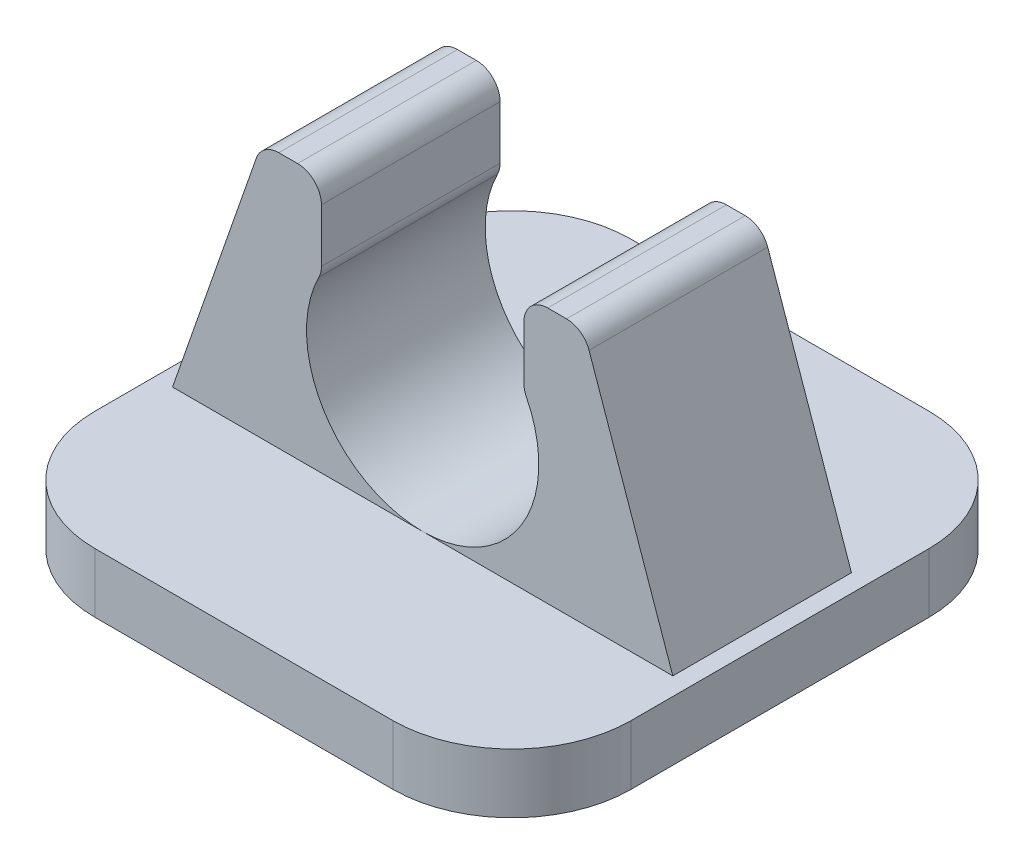
ISO-10303-21;
HEADER;
FILE_DESCRIPTION(('STEP AP214'),'2;1');
FILE_NAME('part.step','',(''),(''),'','','');
FILE_SCHEMA(('AUTOMOTIVE_DESIGN { 1 0 10303 214 1 1 1 1 }'));
ENDSEC;
DATA;
#1=APPLICATION_CONTEXT('core data for automotive mechanical design processes');
#2=APPLICATION_PROTOCOL_DEFINITION('international standard','automotive_design',2000,#1);
#3=PRODUCT_CONTEXT('',#1,'mechanical');
#4=PRODUCT('Part','Part','',(#3));
#5=PRODUCT_RELATED_PRODUCT_CATEGORY('part','',(#4));
#6=PRODUCT_DEFINITION_FORMATION('','',#4);
#7=PRODUCT_DEFINITION_CONTEXT('part definition',#1,'design');
#8=PRODUCT_DEFINITION('design','',#6,#7);
#9=PRODUCT_DEFINITION_SHAPE('','',#8);
#10=(LENGTH_UNIT() NAMED_UNIT(*) SI_UNIT(.MILLI.,.METRE.));
#11=(NAMED_UNIT(*) PLANE_ANGLE_UNIT() SI_UNIT($,.RADIAN.));
#12=(NAMED_UNIT(*) SI_UNIT($,.STERADIAN.) SOLID_ANGLE_UNIT());
#13=UNCERTAINTY_MEASURE_WITH_UNIT(LENGTH_MEASURE(1.E-05),#10,'distance_accuracy_value','');
#14=(GEOMETRIC_REPRESENTATION_CONTEXT(3) GLOBAL_UNCERTAINTY_ASSIGNED_CONTEXT((#13)) GLOBAL_UNIT_ASSIGNED_CONTEXT((#10,
#11,#12)) REPRESENTATION_CONTEXT('',''));
#15=CARTESIAN_POINT('',(0.,0.,0.));
#16=DIRECTION('',(0.,0.,1.));
#17=DIRECTION('',(1.,0.,0.));
#18=AXIS2_PLACEMENT_3D('',#15,#16,#17);
#19=CARTESIAN_POINT('',(0.,1.,0.));
#20=DIRECTION('',(0.,-1.,0.));
#21=DIRECTION('',(0.,0.,-1.));
#22=AXIS2_PLACEMENT_3D('',#19,#20,#21);
#23=PLANE('',#22);
#24=DIRECTION('',(1.,0.,0.));
#25=VECTOR('',#24,1.);
#26=CARTESIAN_POINT('',(-4.5,1.,4.5));
#27=LINE('',#26,#25);
#28=CARTESIAN_POINT('',(-2.5,1.,4.5));
#29=VERTEX_POINT('',#28);
#30=CARTESIAN_POINT('',(2.5,1.,4.5));
#31=VERTEX_POINT('',#30);
#32=EDGE_CURVE('E316',#29,#31,#27,.T.);
#33=ORIENTED_EDGE('',*,*,#32,.T.);
#34=CARTESIAN_POINT('',(2.5,1.,2.5));
#35=DIRECTION('',(0.,-1.,0.));
#36=DIRECTION('',(0.,0.,-1.));
#37=AXIS2_PLACEMENT_3D('',#34,#35,#36);
#38=CIRCLE('',#37,2.);
#39=CARTESIAN_POINT('',(4.5,1.,2.5));
#40=VERTEX_POINT('',#39);
#41=EDGE_CURVE('E402',#31,#40,#38,.F.);
#42=ORIENTED_EDGE('',*,*,#41,.T.);
#43=DIRECTION('',(0.,0.,-1.));
#44=VECTOR('',#43,1.);
#45=CARTESIAN_POINT('',(4.5,1.,4.5));
#46=LINE('',#45,#44);
#47=CARTESIAN_POINT('',(4.5,1.,-2.5));
#48=VERTEX_POINT('',#47);
#49=EDGE_CURVE('E308',#40,#48,#46,.T.);
#50=ORIENTED_EDGE('',*,*,#49,.T.);
#51=CARTESIAN_POINT('',(2.5,1.,-2.5));
#52=DIRECTION('',(0.,-1.,0.));
#53=DIRECTION('',(0.,0.,-1.));
#54=AXIS2_PLACEMENT_3D('',#51,#52,#53);
#55=CIRCLE('',#54,2.);
#56=CARTESIAN_POINT('',(2.5,1.,-4.5));
#57=VERTEX_POINT('',#56);
#58=EDGE_CURVE('E397',#48,#57,#55,.F.);
#59=ORIENTED_EDGE('',*,*,#58,.T.);
#60=DIRECTION('',(-1.,0.,0.));
#61=VECTOR('',#60,1.);
#62=CARTESIAN_POINT('',(-4.5,1.,-4.5));
#63=LINE('',#62,#61);
#64=CARTESIAN_POINT('',(-2.5,1.,-4.5));
#65=VERTEX_POINT('',#64);
#66=EDGE_CURVE('E311',#57,#65,#63,.T.);
#67=ORIENTED_EDGE('',*,*,#66,.T.);
#68=CARTESIAN_POINT('',(-2.5,1.,-2.5));
#69=DIRECTION('',(0.,-1.,0.));
#70=DIRECTION('',(0.,0.,-1.));
#71=AXIS2_PLACEMENT_3D('',#68,#69,#70);
#72=CIRCLE('',#71,2.);
#73=CARTESIAN_POINT('',(-4.5,1.,-2.5));
#74=VERTEX_POINT('',#73);
#75=EDGE_CURVE('E95',#65,#74,#72,.F.);
#76=ORIENTED_EDGE('',*,*,#75,.T.);
#77=DIRECTION('',(0.,0.,1.));
#78=VECTOR('',#77,1.);
#79=CARTESIAN_POINT('',(-4.5,1.,4.5));
#80=LINE('',#79,#78);
#81=CARTESIAN_POINT('',(-4.5,1.,2.5));
#82=VERTEX_POINT('',#81);
#83=EDGE_CURVE('E314',#74,#82,#80,.T.);
#84=ORIENTED_EDGE('',*,*,#83,.T.);
#85=CARTESIAN_POINT('',(-2.5,1.,2.5));
#86=DIRECTION('',(0.,-1.,0.));
#87=DIRECTION('',(0.,0.,-1.));
#88=AXIS2_PLACEMENT_3D('',#85,#86,#87);
#89=CIRCLE('',#88,2.);
#90=EDGE_CURVE('E400',#82,#29,#89,.F.);
#91=ORIENTED_EDGE('',*,*,#90,.T.);
#92=EDGE_LOOP('',(#33,#42,#50,#59,#67,#76,#84,#91));
#93=FACE_BOUND('',#92,.T.);
#94=DIRECTION('',(-1.,0.,0.));
#95=VECTOR('',#94,1.);
#96=CARTESIAN_POINT('',(0.,1.,-1.5));
#97=LINE('',#96,#95);
#98=CARTESIAN_POINT('',(4.2,1.,-1.5));
#99=VERTEX_POINT('',#98);
#100=CARTESIAN_POINT('',(0.,1.,-1.5));
#101=VERTEX_POINT('',#100);
#102=EDGE_CURVE('E241',#99,#101,#97,.T.);
#103=ORIENTED_EDGE('',*,*,#102,.F.);
#104=DIRECTION('',(0.,0.,1.));
#105=VECTOR('',#104,1.);
#106=CARTESIAN_POINT('',(4.2,1.,-1.5));
#107=LINE('',#106,#105);
#108=CARTESIAN_POINT('',(4.2,1.,1.5));
#109=VERTEX_POINT('',#108);
#110=EDGE_CURVE('E259',#99,#109,#107,.T.);
#111=ORIENTED_EDGE('',*,*,#110,.T.);
#112=DIRECTION('',(-1.,0.,0.));
#113=VECTOR('',#112,1.);
#114=CARTESIAN_POINT('',(0.,1.,1.5));
#115=LINE('',#114,#113);
#116=CARTESIAN_POINT('',(0.,1.,1.5));
#117=VERTEX_POINT('',#116);
#118=EDGE_CURVE('E256',#109,#117,#115,.T.);
#119=ORIENTED_EDGE('',*,*,#118,.T.);
#120=DIRECTION('',(-1.,0.,0.));
#121=VECTOR('',#120,1.);
#122=CARTESIAN_POINT('',(0.,1.,1.5));
#123=LINE('',#122,#121);
#124=CARTESIAN_POINT('',(-4.2,1.,1.5));
#125=VERTEX_POINT('',#124);
#126=EDGE_CURVE('E244',#117,#125,#123,.T.);
#127=ORIENTED_EDGE('',*,*,#126,.T.);
#128=DIRECTION('',(0.,0.,1.));
#129=VECTOR('',#128,1.);
#130=CARTESIAN_POINT('',(-4.2,1.,-1.5));
#131=LINE('',#130,#129);
#132=CARTESIAN_POINT('',(-4.2,1.,-1.5));
#133=VERTEX_POINT('',#132);
#134=EDGE_CURVE('E298',#133,#125,#131,.T.);
#135=ORIENTED_EDGE('',*,*,#134,.F.);
#136=DIRECTION('',(-1.,0.,0.));
#137=VECTOR('',#136,1.);
#138=CARTESIAN_POINT('',(0.,1.,-1.5));
#139=LINE('',#138,#137);
#140=EDGE_CURVE('E296',#101,#133,#139,.T.);
#141=ORIENTED_EDGE('',*,*,#140,.F.);
#142=EDGE_LOOP('',(#103,#111,#119,#127,#135,#141));
#143=FACE_BOUND('',#142,.T.);
#144=ADVANCED_FACE('F73',(#93,#143),#23,.F.);
#145=CARTESIAN_POINT('',(4.5,1.,4.5));
#146=DIRECTION('',(-1.,0.,0.));
#147=DIRECTION('',(0.,0.,1.));
#148=AXIS2_PLACEMENT_3D('',#145,#146,#147);
#149=PLANE('',#148);
#150=ORIENTED_EDGE('',*,*,#49,.F.);
#151=DIRECTION('',(0.,-1.,0.));
#152=VECTOR('',#151,1.);
#153=CARTESIAN_POINT('',(4.5,1.,2.5));
#154=LINE('',#153,#152);
#155=CARTESIAN_POINT('',(4.5,0.,2.5));
#156=VERTEX_POINT('',#155);
#157=EDGE_CURVE('E381',#40,#156,#154,.T.);
#158=ORIENTED_EDGE('',*,*,#157,.T.);
#159=DIRECTION('',(0.,0.,-1.));
#160=VECTOR('',#159,1.);
#161=CARTESIAN_POINT('',(4.5,0.,4.5));
#162=LINE('',#161,#160);
#163=CARTESIAN_POINT('',(4.5,0.,-2.5));
#164=VERTEX_POINT('',#163);
#165=EDGE_CURVE('E307',#156,#164,#162,.T.);
#166=ORIENTED_EDGE('',*,*,#165,.T.);
#167=DIRECTION('',(0.,-1.,0.));
#168=VECTOR('',#167,1.);
#169=CARTESIAN_POINT('',(4.5,1.,-2.5));
#170=LINE('',#169,#168);
#171=EDGE_CURVE('E379',#164,#48,#170,.F.);
#172=ORIENTED_EDGE('',*,*,#171,.T.);
#173=EDGE_LOOP('',(#150,#158,#166,#172));
#174=FACE_BOUND('',#173,.T.);
#175=ADVANCED_FACE('F439',(#174),#149,.F.);
#176=CARTESIAN_POINT('',(-4.5,1.,-4.5));
#177=DIRECTION('',(0.,0.,1.));
#178=DIRECTION('',(1.,0.,0.));
#179=AXIS2_PLACEMENT_3D('',#176,#177,#178);
#180=PLANE('',#179);
#181=DIRECTION('',(-1.,0.,0.));
#182=VECTOR('',#181,1.);
#183=CARTESIAN_POINT('',(-4.5,0.,-4.5));
#184=LINE('',#183,#182);
#185=CARTESIAN_POINT('',(2.5,0.,-4.5));
#186=VERTEX_POINT('',#185);
#187=CARTESIAN_POINT('',(-2.5,0.,-4.5));
#188=VERTEX_POINT('',#187);
#189=EDGE_CURVE('E322',#186,#188,#184,.T.);
#190=ORIENTED_EDGE('',*,*,#189,.T.);
#191=DIRECTION('',(0.,-1.,0.));
#192=VECTOR('',#191,1.);
#193=CARTESIAN_POINT('',(-2.5,1.,-4.5));
#194=LINE('',#193,#192);
#195=EDGE_CURVE('E12',#188,#65,#194,.F.);
#196=ORIENTED_EDGE('',*,*,#195,.T.);
#197=ORIENTED_EDGE('',*,*,#66,.F.);
#198=DIRECTION('',(0.,-1.,0.));
#199=VECTOR('',#198,1.);
#200=CARTESIAN_POINT('',(2.5,1.,-4.5));
#201=LINE('',#200,#199);
#202=EDGE_CURVE('E81',#57,#186,#201,.T.);
#203=ORIENTED_EDGE('',*,*,#202,.T.);
#204=EDGE_LOOP('',(#190,#196,#197,#203));
#205=FACE_BOUND('',#204,.T.);
#206=ADVANCED_FACE('F412',(#205),#180,.F.);
#207=CARTESIAN_POINT('',(-4.5,1.,4.5));
#208=DIRECTION('',(1.,0.,0.));
#209=DIRECTION('',(0.,0.,-1.));
#210=AXIS2_PLACEMENT_3D('',#207,#208,#209);
#211=PLANE('',#210);
#212=DIRECTION('',(0.,0.,1.));
#213=VECTOR('',#212,1.);
#214=CARTESIAN_POINT('',(-4.5,0.,4.5));
#215=LINE('',#214,#213);
#216=CARTESIAN_POINT('',(-4.5,0.,-2.5));
#217=VERTEX_POINT('',#216);
#218=CARTESIAN_POINT('',(-4.5,0.,2.5));
#219=VERTEX_POINT('',#218);
#220=EDGE_CURVE('E325',#217,#219,#215,.T.);
#221=ORIENTED_EDGE('',*,*,#220,.T.);
#222=DIRECTION('',(0.,-1.,0.));
#223=VECTOR('',#222,1.);
#224=CARTESIAN_POINT('',(-4.5,1.,2.5));
#225=LINE('',#224,#223);
#226=EDGE_CURVE('E88',#219,#82,#225,.F.);
#227=ORIENTED_EDGE('',*,*,#226,.T.);
#228=ORIENTED_EDGE('',*,*,#83,.F.);
#229=DIRECTION('',(0.,-1.,0.));
#230=VECTOR('',#229,1.);
#231=CARTESIAN_POINT('',(-4.5,1.,-2.5));
#232=LINE('',#231,#230);
#233=EDGE_CURVE('E404',#74,#217,#232,.T.);
#234=ORIENTED_EDGE('',*,*,#233,.T.);
#235=EDGE_LOOP('',(#221,#227,#228,#234));
#236=FACE_BOUND('',#235,.T.);
#237=ADVANCED_FACE('F423',(#236),#211,.F.);
#238=CARTESIAN_POINT('',(-4.5,1.,4.5));
#239=DIRECTION('',(0.,0.,-1.));
#240=DIRECTION('',(-1.,0.,0.));
#241=AXIS2_PLACEMENT_3D('',#238,#239,#240);
#242=PLANE('',#241);
#243=DIRECTION('',(1.,0.,0.));
#244=VECTOR('',#243,1.);
#245=CARTESIAN_POINT('',(-4.5,0.,4.5));
#246=LINE('',#245,#244);
#247=CARTESIAN_POINT('',(-2.5,0.,4.5));
#248=VERTEX_POINT('',#247);
#249=CARTESIAN_POINT('',(2.5,0.,4.5));
#250=VERTEX_POINT('',#249);
#251=EDGE_CURVE('E312',#248,#250,#246,.T.);
#252=ORIENTED_EDGE('',*,*,#251,.T.);
#253=DIRECTION('',(0.,-1.,0.));
#254=VECTOR('',#253,1.);
#255=CARTESIAN_POINT('',(2.5,1.,4.5));
#256=LINE('',#255,#254);
#257=EDGE_CURVE('E395',#250,#31,#256,.F.);
#258=ORIENTED_EDGE('',*,*,#257,.T.);
#259=ORIENTED_EDGE('',*,*,#32,.F.);
#260=DIRECTION('',(0.,-1.,0.));
#261=VECTOR('',#260,1.);
#262=CARTESIAN_POINT('',(-2.5,1.,4.5));
#263=LINE('',#262,#261);
#264=EDGE_CURVE('E392',#29,#248,#263,.T.);
#265=ORIENTED_EDGE('',*,*,#264,.T.);
#266=EDGE_LOOP('',(#252,#258,#259,#265));
#267=FACE_BOUND('',#266,.T.);
#268=ADVANCED_FACE('F431',(#267),#242,.F.);
#269=CARTESIAN_POINT('',(0.,0.,0.));
#270=DIRECTION('',(0.,-1.,0.));
#271=DIRECTION('',(0.,0.,-1.));
#272=AXIS2_PLACEMENT_3D('',#269,#270,#271);
#273=PLANE('',#272);
#274=ORIENTED_EDGE('',*,*,#165,.F.);
#275=CARTESIAN_POINT('',(2.5,0.,2.5));
#276=DIRECTION('',(0.,-1.,0.));
#277=DIRECTION('',(0.,0.,-1.));
#278=AXIS2_PLACEMENT_3D('',#275,#276,#277);
#279=CIRCLE('',#278,2.);
#280=EDGE_CURVE('E390',#156,#250,#279,.T.);
#281=ORIENTED_EDGE('',*,*,#280,.T.);
#282=ORIENTED_EDGE('',*,*,#251,.F.);
#283=CARTESIAN_POINT('',(-2.5,0.,2.5));
#284=DIRECTION('',(0.,-1.,0.));
#285=DIRECTION('',(0.,0.,-1.));
#286=AXIS2_PLACEMENT_3D('',#283,#284,#285);
#287=CIRCLE('',#286,2.);
#288=EDGE_CURVE('E388',#248,#219,#287,.T.);
#289=ORIENTED_EDGE('',*,*,#288,.T.);
#290=ORIENTED_EDGE('',*,*,#220,.F.);
#291=CARTESIAN_POINT('',(-2.5,0.,-2.5));
#292=DIRECTION('',(0.,-1.,0.));
#293=DIRECTION('',(0.,0.,-1.));
#294=AXIS2_PLACEMENT_3D('',#291,#292,#293);
#295=CIRCLE('',#294,2.);
#296=EDGE_CURVE('E386',#217,#188,#295,.T.);
#297=ORIENTED_EDGE('',*,*,#296,.T.);
#298=ORIENTED_EDGE('',*,*,#189,.F.);
#299=CARTESIAN_POINT('',(2.5,0.,-2.5));
#300=DIRECTION('',(0.,-1.,0.));
#301=DIRECTION('',(0.,0.,-1.));
#302=AXIS2_PLACEMENT_3D('',#299,#300,#301);
#303=CIRCLE('',#302,2.);
#304=EDGE_CURVE('E384',#186,#164,#303,.T.);
#305=ORIENTED_EDGE('',*,*,#304,.T.);
#306=EDGE_LOOP('',(#274,#281,#282,#289,#290,#297,#298,#305));
#307=FACE_BOUND('',#306,.T.);
#308=ADVANCED_FACE('F418',(#307),#273,.T.);
#309=CARTESIAN_POINT('',(0.,2.95,-1.5));
#310=DIRECTION('',(0.,0.,1.));
#311=DIRECTION('',(1.,0.,0.));
#312=AXIS2_PLACEMENT_3D('',#309,#310,#311);
#313=CYLINDRICAL_SURFACE('',#312,1.95);
#314=CARTESIAN_POINT('',(0.,2.95,1.5));
#315=DIRECTION('',(0.,0.,1.));
#316=DIRECTION('',(1.,0.,0.));
#317=AXIS2_PLACEMENT_3D('',#314,#315,#316);
#318=CIRCLE('',#317,1.95);
#319=CARTESIAN_POINT('',(1.74255319148936,3.82521904391429,1.5));
#320=VERTEX_POINT('',#319);
#321=EDGE_CURVE('E234',#117,#320,#318,.T.);
#322=ORIENTED_EDGE('',*,*,#321,.T.);
#323=DIRECTION('',(0.,0.,1.));
#324=VECTOR('',#323,1.);
#325=CARTESIAN_POINT('',(1.74255319148936,3.82521904391429,-1.5));
#326=LINE('',#325,#324);
#327=CARTESIAN_POINT('',(1.74255319148936,3.82521904391429,-1.5));
#328=VERTEX_POINT('',#327);
#329=EDGE_CURVE('E339',#320,#328,#326,.F.);
#330=ORIENTED_EDGE('',*,*,#329,.T.);
#331=CARTESIAN_POINT('',(0.,2.95,-1.5));
#332=DIRECTION('',(0.,0.,1.));
#333=DIRECTION('',(1.,0.,0.));
#334=AXIS2_PLACEMENT_3D('',#331,#332,#333);
#335=CIRCLE('',#334,1.95);
#336=EDGE_CURVE('E278',#101,#328,#335,.T.);
#337=ORIENTED_EDGE('',*,*,#336,.F.);
#338=CARTESIAN_POINT('',(0.,2.95,-1.5));
#339=DIRECTION('',(0.,0.,1.));
#340=DIRECTION('',(1.,0.,0.));
#341=AXIS2_PLACEMENT_3D('',#338,#339,#340);
#342=CIRCLE('',#341,1.95);
#343=CARTESIAN_POINT('',(-1.74255319148936,3.82521904391429,-1.5));
#344=VERTEX_POINT('',#343);
#345=EDGE_CURVE('E252',#344,#101,#342,.T.);
#346=ORIENTED_EDGE('',*,*,#345,.F.);
#347=DIRECTION('',(0.,0.,1.));
#348=VECTOR('',#347,1.);
#349=CARTESIAN_POINT('',(-1.74255319148936,3.82521904391429,-1.5));
#350=LINE('',#349,#348);
#351=CARTESIAN_POINT('',(-1.74255319148936,3.82521904391429,1.5));
#352=VERTEX_POINT('',#351);
#353=EDGE_CURVE('E238',#344,#352,#350,.T.);
#354=ORIENTED_EDGE('',*,*,#353,.T.);
#355=CARTESIAN_POINT('',(0.,2.95,1.5));
#356=DIRECTION('',(0.,0.,1.));
#357=DIRECTION('',(1.,0.,0.));
#358=AXIS2_PLACEMENT_3D('',#355,#356,#357);
#359=CIRCLE('',#358,1.95);
#360=EDGE_CURVE('E230',#352,#117,#359,.T.);
#361=ORIENTED_EDGE('',*,*,#360,.T.);
#362=EDGE_LOOP('',(#322,#330,#337,#346,#354,#361));
#363=FACE_BOUND('',#362,.T.);
#364=ADVANCED_FACE('F232',(#363),#313,.F.);
#365=CARTESIAN_POINT('',(-4.05535197685632,1.41465766634523,-1.5));
#366=DIRECTION('',(-0.944200181445776,0.329372156318294,0.));
#367=DIRECTION('',(-0.329372156318294,-0.944200181445777,0.));
#368=AXIS2_PLACEMENT_3D('',#365,#366,#367);
#369=PLANE('',#368);
#370=DIRECTION('',(-0.329372156318294,-0.944200181445777,0.));
#371=VECTOR('',#370,1.);
#372=CARTESIAN_POINT('',(-4.05535197685632,1.41465766634523,1.5));
#373=LINE('',#372,#371);
#374=CARTESIAN_POINT('',(-2.79357597818815,5.03174886252732,1.5));
#375=VERTEX_POINT('',#374);
#376=EDGE_CURVE('E248',#375,#125,#373,.T.);
#377=ORIENTED_EDGE('',*,*,#376,.F.);
#378=DIRECTION('',(0.,0.,1.));
#379=VECTOR('',#378,1.);
#380=CARTESIAN_POINT('',(-2.79357597818815,5.03174886252732,-1.5));
#381=LINE('',#380,#379);
#382=CARTESIAN_POINT('',(-2.79357597818815,5.03174886252732,-1.5));
#383=VERTEX_POINT('',#382);
#384=EDGE_CURVE('E377',#375,#383,#381,.F.);
#385=ORIENTED_EDGE('',*,*,#384,.T.);
#386=DIRECTION('',(-0.329372156318294,-0.944200181445777,0.));
#387=VECTOR('',#386,1.);
#388=CARTESIAN_POINT('',(-4.05535197685632,1.41465766634523,-1.5));
#389=LINE('',#388,#387);
#390=EDGE_CURVE('E294',#383,#133,#389,.T.);
#391=ORIENTED_EDGE('',*,*,#390,.T.);
#392=ORIENTED_EDGE('',*,*,#134,.T.);
#393=EDGE_LOOP('',(#377,#385,#391,#392));
#394=FACE_BOUND('',#393,.T.);
#395=ADVANCED_FACE('F635',(#394),#369,.T.);
#396=CARTESIAN_POINT('',(0.,5.3,-1.5));
#397=DIRECTION('',(0.,1.,0.));
#398=DIRECTION('',(0.,0.,1.));
#399=AXIS2_PLACEMENT_3D('',#396,#397,#398);
#400=PLANE('',#399);
#401=DIRECTION('',(-1.,0.,0.));
#402=VECTOR('',#401,1.);
#403=CARTESIAN_POINT('',(0.,5.3,-1.5));
#404=LINE('',#403,#402);
#405=CARTESIAN_POINT('',(-2.1,5.3,-1.5));
#406=VERTEX_POINT('',#405);
#407=CARTESIAN_POINT('',(-2.41589590560984,5.3,-1.5));
#408=VERTEX_POINT('',#407);
#409=EDGE_CURVE('E291',#406,#408,#404,.T.);
#410=ORIENTED_EDGE('',*,*,#409,.T.);
#411=DIRECTION('',(0.,0.,1.));
#412=VECTOR('',#411,1.);
#413=CARTESIAN_POINT('',(-2.41589590560984,5.3,-1.5));
#414=LINE('',#413,#412);
#415=CARTESIAN_POINT('',(-2.41589590560984,5.3,1.5));
#416=VERTEX_POINT('',#415);
#417=EDGE_CURVE('E374',#408,#416,#414,.T.);
#418=ORIENTED_EDGE('',*,*,#417,.T.);
#419=DIRECTION('',(-1.,0.,0.));
#420=VECTOR('',#419,1.);
#421=CARTESIAN_POINT('',(0.,5.3,1.5));
#422=LINE('',#421,#420);
#423=CARTESIAN_POINT('',(-2.1,5.3,1.5));
#424=VERTEX_POINT('',#423);
#425=EDGE_CURVE('E302',#424,#416,#422,.T.);
#426=ORIENTED_EDGE('',*,*,#425,.F.);
#427=DIRECTION('',(0.,0.,1.));
#428=VECTOR('',#427,1.);
#429=CARTESIAN_POINT('',(-2.1,5.3,-1.5));
#430=LINE('',#429,#428);
#431=EDGE_CURVE('E372',#424,#406,#430,.F.);
#432=ORIENTED_EDGE('',*,*,#431,.T.);
#433=EDGE_LOOP('',(#410,#418,#426,#432));
#434=FACE_BOUND('',#433,.T.);
#435=ADVANCED_FACE('F626',(#434),#400,.T.);
#436=CARTESIAN_POINT('',(-1.7,0.,-1.5));
#437=DIRECTION('',(1.,0.,0.));
#438=DIRECTION('',(0.,0.,-1.));
#439=AXIS2_PLACEMENT_3D('',#436,#437,#438);
#440=PLANE('',#439);
#441=DIRECTION('',(0.,1.,0.));
#442=VECTOR('',#441,1.);
#443=CARTESIAN_POINT('',(-1.7,0.,1.5));
#444=LINE('',#443,#442);
#445=CARTESIAN_POINT('',(-1.7,4.00475115548645,1.5));
#446=VERTEX_POINT('',#445);
#447=CARTESIAN_POINT('',(-1.7,4.9,1.5));
#448=VERTEX_POINT('',#447);
#449=EDGE_CURVE('E240',#446,#448,#444,.T.);
#450=ORIENTED_EDGE('',*,*,#449,.F.);
#451=DIRECTION('',(0.,0.,-1.));
#452=VECTOR('',#451,1.);
#453=CARTESIAN_POINT('',(-1.7,4.00475115548645,-1.5));
#454=LINE('',#453,#452);
#455=CARTESIAN_POINT('',(-1.7,4.00475115548645,-1.5));
#456=VERTEX_POINT('',#455);
#457=EDGE_CURVE('E356',#446,#456,#454,.T.);
#458=ORIENTED_EDGE('',*,*,#457,.T.);
#459=DIRECTION('',(0.,1.,0.));
#460=VECTOR('',#459,1.);
#461=CARTESIAN_POINT('',(-1.7,0.,-1.5));
#462=LINE('',#461,#460);
#463=CARTESIAN_POINT('',(-1.7,4.9,-1.5));
#464=VERTEX_POINT('',#463);
#465=EDGE_CURVE('E288',#456,#464,#462,.T.);
#466=ORIENTED_EDGE('',*,*,#465,.T.);
#467=DIRECTION('',(0.,0.,1.));
#468=VECTOR('',#467,1.);
#469=CARTESIAN_POINT('',(-1.7,4.9,-1.5));
#470=LINE('',#469,#468);
#471=EDGE_CURVE('E353',#464,#448,#470,.T.);
#472=ORIENTED_EDGE('',*,*,#471,.T.);
#473=EDGE_LOOP('',(#450,#458,#466,#472));
#474=FACE_BOUND('',#473,.T.);
#475=ADVANCED_FACE('F616',(#474),#440,.T.);
#476=CARTESIAN_POINT('',(0.,0.,-1.5));
#477=DIRECTION('',(0.,0.,1.));
#478=DIRECTION('',(1.,0.,0.));
#479=AXIS2_PLACEMENT_3D('',#476,#477,#478);
#480=PLANE('',#479);
#481=ORIENTED_EDGE('',*,*,#465,.F.);
#482=CARTESIAN_POINT('',(-2.1,4.00475115548645,-1.5));
#483=DIRECTION('',(0.,0.,1.));
#484=DIRECTION('',(1.,0.,0.));
#485=AXIS2_PLACEMENT_3D('',#482,#483,#484);
#486=CIRCLE('',#485,0.4);
#487=EDGE_CURVE('E362',#456,#344,#486,.F.);
#488=ORIENTED_EDGE('',*,*,#487,.T.);
#489=ORIENTED_EDGE('',*,*,#345,.T.);
#490=ORIENTED_EDGE('',*,*,#140,.T.);
#491=ORIENTED_EDGE('',*,*,#390,.F.);
#492=CARTESIAN_POINT('',(-2.41589590560984,4.9,-1.5));
#493=DIRECTION('',(0.,0.,1.));
#494=DIRECTION('',(1.,0.,0.));
#495=AXIS2_PLACEMENT_3D('',#492,#493,#494);
#496=CIRCLE('',#495,0.4);
#497=EDGE_CURVE('E360',#383,#408,#496,.F.);
#498=ORIENTED_EDGE('',*,*,#497,.T.);
#499=ORIENTED_EDGE('',*,*,#409,.F.);
#500=CARTESIAN_POINT('',(-2.1,4.9,-1.5));
#501=DIRECTION('',(0.,0.,1.));
#502=DIRECTION('',(1.,0.,0.));
#503=AXIS2_PLACEMENT_3D('',#500,#501,#502);
#504=CIRCLE('',#503,0.4);
#505=EDGE_CURVE('E358',#406,#464,#504,.F.);
#506=ORIENTED_EDGE('',*,*,#505,.T.);
#507=EDGE_LOOP('',(#481,#488,#489,#490,#491,#498,#499,#506));
#508=FACE_BOUND('',#507,.T.);
#509=ADVANCED_FACE('F607',(#508),#480,.F.);
#510=CARTESIAN_POINT('',(0.,0.,1.5));
#511=DIRECTION('',(0.,0.,1.));
#512=DIRECTION('',(1.,0.,0.));
#513=AXIS2_PLACEMENT_3D('',#510,#511,#512);
#514=PLANE('',#513);
#515=ORIENTED_EDGE('',*,*,#360,.F.);
#516=CARTESIAN_POINT('',(-2.1,4.00475115548645,1.5));
#517=DIRECTION('',(0.,0.,1.));
#518=DIRECTION('',(1.,0.,0.));
#519=AXIS2_PLACEMENT_3D('',#516,#517,#518);
#520=CIRCLE('',#519,0.4);
#521=EDGE_CURVE('E351',#352,#446,#520,.T.);
#522=ORIENTED_EDGE('',*,*,#521,.T.);
#523=ORIENTED_EDGE('',*,*,#449,.T.);
#524=CARTESIAN_POINT('',(-2.1,4.9,1.5));
#525=DIRECTION('',(0.,0.,1.));
#526=DIRECTION('',(1.,0.,0.));
#527=AXIS2_PLACEMENT_3D('',#524,#525,#526);
#528=CIRCLE('',#527,0.4);
#529=EDGE_CURVE('E347',#448,#424,#528,.T.);
#530=ORIENTED_EDGE('',*,*,#529,.T.);
#531=ORIENTED_EDGE('',*,*,#425,.T.);
#532=CARTESIAN_POINT('',(-2.41589590560984,4.9,1.5));
#533=DIRECTION('',(0.,0.,1.));
#534=DIRECTION('',(1.,0.,0.));
#535=AXIS2_PLACEMENT_3D('',#532,#533,#534);
#536=CIRCLE('',#535,0.4);
#537=EDGE_CURVE('E349',#416,#375,#536,.T.);
#538=ORIENTED_EDGE('',*,*,#537,.T.);
#539=ORIENTED_EDGE('',*,*,#376,.T.);
#540=ORIENTED_EDGE('',*,*,#126,.F.);
#541=EDGE_LOOP('',(#515,#522,#523,#530,#531,#538,#539,#540));
#542=FACE_BOUND('',#541,.T.);
#543=ADVANCED_FACE('F246',(#542),#514,.T.);
#544=CARTESIAN_POINT('',(1.7,0.,-1.5));
#545=DIRECTION('',(1.,0.,0.));
#546=DIRECTION('',(0.,0.,-1.));
#547=AXIS2_PLACEMENT_3D('',#544,#545,#546);
#548=PLANE('',#547);
#549=DIRECTION('',(0.,1.,0.));
#550=VECTOR('',#549,1.);
#551=CARTESIAN_POINT('',(1.7,0.,-1.5));
#552=LINE('',#551,#550);
#553=CARTESIAN_POINT('',(1.7,4.00475115548645,-1.5));
#554=VERTEX_POINT('',#553);
#555=CARTESIAN_POINT('',(1.7,4.9,-1.5));
#556=VERTEX_POINT('',#555);
#557=EDGE_CURVE('E274',#554,#556,#552,.T.);
#558=ORIENTED_EDGE('',*,*,#557,.F.);
#559=DIRECTION('',(0.,0.,1.));
#560=VECTOR('',#559,1.);
#561=CARTESIAN_POINT('',(1.7,4.00475115548645,-1.5));
#562=LINE('',#561,#560);
#563=CARTESIAN_POINT('',(1.7,4.00475115548645,1.5));
#564=VERTEX_POINT('',#563);
#565=EDGE_CURVE('E330',#554,#564,#562,.T.);
#566=ORIENTED_EDGE('',*,*,#565,.T.);
#567=DIRECTION('',(0.,1.,0.));
#568=VECTOR('',#567,1.);
#569=CARTESIAN_POINT('',(1.7,0.,1.5));
#570=LINE('',#569,#568);
#571=CARTESIAN_POINT('',(1.7,4.9,1.5));
#572=VERTEX_POINT('',#571);
#573=EDGE_CURVE('E267',#564,#572,#570,.T.);
#574=ORIENTED_EDGE('',*,*,#573,.T.);
#575=DIRECTION('',(0.,0.,1.));
#576=VECTOR('',#575,1.);
#577=CARTESIAN_POINT('',(1.7,4.9,-1.5));
#578=LINE('',#577,#576);
#579=EDGE_CURVE('E319',#572,#556,#578,.F.);
#580=ORIENTED_EDGE('',*,*,#579,.T.);
#581=EDGE_LOOP('',(#558,#566,#574,#580));
#582=FACE_BOUND('',#581,.T.);
#583=ADVANCED_FACE('F588',(#582),#548,.F.);
#584=CARTESIAN_POINT('',(0.,5.3,-1.5));
#585=DIRECTION('',(0.,-1.,0.));
#586=DIRECTION('',(0.,0.,-1.));
#587=AXIS2_PLACEMENT_3D('',#584,#585,#586);
#588=PLANE('',#587);
#589=DIRECTION('',(1.,0.,0.));
#590=VECTOR('',#589,1.);
#591=CARTESIAN_POINT('',(0.,5.3,1.5));
#592=LINE('',#591,#590);
#593=CARTESIAN_POINT('',(2.1,5.3,1.5));
#594=VERTEX_POINT('',#593);
#595=CARTESIAN_POINT('',(2.41589590560984,5.3,1.5));
#596=VERTEX_POINT('',#595);
#597=EDGE_CURVE('E270',#594,#596,#592,.T.);
#598=ORIENTED_EDGE('',*,*,#597,.T.);
#599=DIRECTION('',(0.,0.,1.));
#600=VECTOR('',#599,1.);
#601=CARTESIAN_POINT('',(2.41589590560984,5.3,-1.5));
#602=LINE('',#601,#600);
#603=CARTESIAN_POINT('',(2.41589590560984,5.3,-1.5));
#604=VERTEX_POINT('',#603);
#605=EDGE_CURVE('E370',#596,#604,#602,.F.);
#606=ORIENTED_EDGE('',*,*,#605,.T.);
#607=DIRECTION('',(1.,0.,0.));
#608=VECTOR('',#607,1.);
#609=CARTESIAN_POINT('',(0.,5.3,-1.5));
#610=LINE('',#609,#608);
#611=CARTESIAN_POINT('',(2.1,5.3,-1.5));
#612=VERTEX_POINT('',#611);
#613=EDGE_CURVE('E277',#612,#604,#610,.T.);
#614=ORIENTED_EDGE('',*,*,#613,.F.);
#615=DIRECTION('',(0.,0.,1.));
#616=VECTOR('',#615,1.);
#617=CARTESIAN_POINT('',(2.1,5.3,-1.5));
#618=LINE('',#617,#616);
#619=EDGE_CURVE('E367',#612,#594,#618,.T.);
#620=ORIENTED_EDGE('',*,*,#619,.T.);
#621=EDGE_LOOP('',(#598,#606,#614,#620));
#622=FACE_BOUND('',#621,.T.);
#623=ADVANCED_FACE('F578',(#622),#588,.F.);
#624=CARTESIAN_POINT('',(4.05535197685632,1.41465766634523,-1.5));
#625=DIRECTION('',(-0.944200181445776,-0.329372156318294,0.));
#626=DIRECTION('',(0.329372156318294,-0.944200181445777,0.));
#627=AXIS2_PLACEMENT_3D('',#624,#625,#626);
#628=PLANE('',#627);
#629=DIRECTION('',(0.329372156318294,-0.944200181445777,0.));
#630=VECTOR('',#629,1.);
#631=CARTESIAN_POINT('',(4.05535197685632,1.41465766634523,-1.5));
#632=LINE('',#631,#630);
#633=CARTESIAN_POINT('',(2.79357597818815,5.03174886252732,-1.5));
#634=VERTEX_POINT('',#633);
#635=EDGE_CURVE('E281',#634,#99,#632,.T.);
#636=ORIENTED_EDGE('',*,*,#635,.F.);
#637=DIRECTION('',(0.,0.,1.));
#638=VECTOR('',#637,1.);
#639=CARTESIAN_POINT('',(2.79357597818815,5.03174886252732,-1.5));
#640=LINE('',#639,#638);
#641=CARTESIAN_POINT('',(2.79357597818815,5.03174886252732,1.5));
#642=VERTEX_POINT('',#641);
#643=EDGE_CURVE('E364',#634,#642,#640,.T.);
#644=ORIENTED_EDGE('',*,*,#643,.T.);
#645=DIRECTION('',(0.329372156318294,-0.944200181445777,0.));
#646=VECTOR('',#645,1.);
#647=CARTESIAN_POINT('',(4.05535197685632,1.41465766634523,1.5));
#648=LINE('',#647,#646);
#649=EDGE_CURVE('E262',#642,#109,#648,.T.);
#650=ORIENTED_EDGE('',*,*,#649,.T.);
#651=ORIENTED_EDGE('',*,*,#110,.F.);
#652=EDGE_LOOP('',(#636,#644,#650,#651));
#653=FACE_BOUND('',#652,.T.);
#654=ADVANCED_FACE('F568',(#653),#628,.F.);
#655=CARTESIAN_POINT('',(0.,0.,-1.5));
#656=DIRECTION('',(0.,0.,1.));
#657=DIRECTION('',(1.,0.,0.));
#658=AXIS2_PLACEMENT_3D('',#655,#656,#657);
#659=PLANE('',#658);
#660=ORIENTED_EDGE('',*,*,#336,.T.);
#661=CARTESIAN_POINT('',(2.1,4.00475115548645,-1.5));
#662=DIRECTION('',(0.,0.,1.));
#663=DIRECTION('',(1.,0.,0.));
#664=AXIS2_PLACEMENT_3D('',#661,#662,#663);
#665=CIRCLE('',#664,0.4);
#666=EDGE_CURVE('E345',#328,#554,#665,.F.);
#667=ORIENTED_EDGE('',*,*,#666,.T.);
#668=ORIENTED_EDGE('',*,*,#557,.T.);
#669=CARTESIAN_POINT('',(2.1,4.9,-1.5));
#670=DIRECTION('',(0.,0.,1.));
#671=DIRECTION('',(1.,0.,0.));
#672=AXIS2_PLACEMENT_3D('',#669,#670,#671);
#673=CIRCLE('',#672,0.4);
#674=EDGE_CURVE('E341',#556,#612,#673,.F.);
#675=ORIENTED_EDGE('',*,*,#674,.T.);
#676=ORIENTED_EDGE('',*,*,#613,.T.);
#677=CARTESIAN_POINT('',(2.41589590560984,4.9,-1.5));
#678=DIRECTION('',(0.,0.,1.));
#679=DIRECTION('',(1.,0.,0.));
#680=AXIS2_PLACEMENT_3D('',#677,#678,#679);
#681=CIRCLE('',#680,0.4);
#682=EDGE_CURVE('E343',#604,#634,#681,.F.);
#683=ORIENTED_EDGE('',*,*,#682,.T.);
#684=ORIENTED_EDGE('',*,*,#635,.T.);
#685=ORIENTED_EDGE('',*,*,#102,.T.);
#686=EDGE_LOOP('',(#660,#667,#668,#675,#676,#683,#684,#685));
#687=FACE_BOUND('',#686,.T.);
#688=ADVANCED_FACE('F559',(#687),#659,.F.);
#689=CARTESIAN_POINT('',(0.,0.,1.5));
#690=DIRECTION('',(0.,0.,1.));
#691=DIRECTION('',(1.,0.,0.));
#692=AXIS2_PLACEMENT_3D('',#689,#690,#691);
#693=PLANE('',#692);
#694=ORIENTED_EDGE('',*,*,#573,.F.);
#695=CARTESIAN_POINT('',(2.1,4.00475115548645,1.5));
#696=DIRECTION('',(0.,0.,1.));
#697=DIRECTION('',(1.,0.,0.));
#698=AXIS2_PLACEMENT_3D('',#695,#696,#697);
#699=CIRCLE('',#698,0.4);
#700=EDGE_CURVE('E266',#564,#320,#699,.T.);
#701=ORIENTED_EDGE('',*,*,#700,.T.);
#702=ORIENTED_EDGE('',*,*,#321,.F.);
#703=ORIENTED_EDGE('',*,*,#118,.F.);
#704=ORIENTED_EDGE('',*,*,#649,.F.);
#705=CARTESIAN_POINT('',(2.41589590560984,4.9,1.5));
#706=DIRECTION('',(0.,0.,1.));
#707=DIRECTION('',(1.,0.,0.));
#708=AXIS2_PLACEMENT_3D('',#705,#706,#707);
#709=CIRCLE('',#708,0.4);
#710=EDGE_CURVE('E335',#642,#596,#709,.T.);
#711=ORIENTED_EDGE('',*,*,#710,.T.);
#712=ORIENTED_EDGE('',*,*,#597,.F.);
#713=CARTESIAN_POINT('',(2.1,4.9,1.5));
#714=DIRECTION('',(0.,0.,1.));
#715=DIRECTION('',(1.,0.,0.));
#716=AXIS2_PLACEMENT_3D('',#713,#714,#715);
#717=CIRCLE('',#716,0.4);
#718=EDGE_CURVE('E333',#594,#572,#717,.T.);
#719=ORIENTED_EDGE('',*,*,#718,.T.);
#720=EDGE_LOOP('',(#694,#701,#702,#703,#704,#711,#712,#719));
#721=FACE_BOUND('',#720,.T.);
#722=ADVANCED_FACE('F265',(#721),#693,.T.);
#723=CARTESIAN_POINT('',(2.1,4.00475115548645,-1.5));
#724=DIRECTION('',(0.,0.,1.));
#725=DIRECTION('',(1.,0.,0.));
#726=AXIS2_PLACEMENT_3D('',#723,#724,#725);
#727=CYLINDRICAL_SURFACE('',#726,0.4);
#728=ORIENTED_EDGE('',*,*,#666,.F.);
#729=ORIENTED_EDGE('',*,*,#329,.F.);
#730=ORIENTED_EDGE('',*,*,#700,.F.);
#731=ORIENTED_EDGE('',*,*,#565,.F.);
#732=EDGE_LOOP('',(#728,#729,#730,#731));
#733=FACE_BOUND('',#732,.T.);
#734=ADVANCED_FACE('F462',(#733),#727,.T.);
#735=CARTESIAN_POINT('',(-2.1,4.00475115548645,-1.5));
#736=DIRECTION('',(0.,0.,1.));
#737=DIRECTION('',(1.,0.,0.));
#738=AXIS2_PLACEMENT_3D('',#735,#736,#737);
#739=CYLINDRICAL_SURFACE('',#738,0.4);
#740=ORIENTED_EDGE('',*,*,#487,.F.);
#741=ORIENTED_EDGE('',*,*,#457,.F.);
#742=ORIENTED_EDGE('',*,*,#521,.F.);
#743=ORIENTED_EDGE('',*,*,#353,.F.);
#744=EDGE_LOOP('',(#740,#741,#742,#743));
#745=FACE_BOUND('',#744,.T.);
#746=ADVANCED_FACE('F465',(#745),#739,.T.);
#747=CARTESIAN_POINT('',(2.41589590560984,4.9,-1.5));
#748=DIRECTION('',(0.,0.,1.));
#749=DIRECTION('',(1.,0.,0.));
#750=AXIS2_PLACEMENT_3D('',#747,#748,#749);
#751=CYLINDRICAL_SURFACE('',#750,0.4);
#752=ORIENTED_EDGE('',*,*,#682,.F.);
#753=ORIENTED_EDGE('',*,*,#605,.F.);
#754=ORIENTED_EDGE('',*,*,#710,.F.);
#755=ORIENTED_EDGE('',*,*,#643,.F.);
#756=EDGE_LOOP('',(#752,#753,#754,#755));
#757=FACE_BOUND('',#756,.T.);
#758=ADVANCED_FACE('F469',(#757),#751,.T.);
#759=CARTESIAN_POINT('',(-2.41589590560984,4.9,-1.5));
#760=DIRECTION('',(0.,0.,1.));
#761=DIRECTION('',(1.,0.,0.));
#762=AXIS2_PLACEMENT_3D('',#759,#760,#761);
#763=CYLINDRICAL_SURFACE('',#762,0.4);
#764=ORIENTED_EDGE('',*,*,#497,.F.);
#765=ORIENTED_EDGE('',*,*,#384,.F.);
#766=ORIENTED_EDGE('',*,*,#537,.F.);
#767=ORIENTED_EDGE('',*,*,#417,.F.);
#768=EDGE_LOOP('',(#764,#765,#766,#767));
#769=FACE_BOUND('',#768,.T.);
#770=ADVANCED_FACE('F473',(#769),#763,.T.);
#771=CARTESIAN_POINT('',(2.1,4.9,-1.5));
#772=DIRECTION('',(0.,0.,1.));
#773=DIRECTION('',(1.,0.,0.));
#774=AXIS2_PLACEMENT_3D('',#771,#772,#773);
#775=CYLINDRICAL_SURFACE('',#774,0.4);
#776=ORIENTED_EDGE('',*,*,#674,.F.);
#777=ORIENTED_EDGE('',*,*,#579,.F.);
#778=ORIENTED_EDGE('',*,*,#718,.F.);
#779=ORIENTED_EDGE('',*,*,#619,.F.);
#780=EDGE_LOOP('',(#776,#777,#778,#779));
#781=FACE_BOUND('',#780,.T.);
#782=ADVANCED_FACE('F477',(#781),#775,.T.);
#783=CARTESIAN_POINT('',(-2.1,4.9,-1.5));
#784=DIRECTION('',(0.,0.,1.));
#785=DIRECTION('',(1.,0.,0.));
#786=AXIS2_PLACEMENT_3D('',#783,#784,#785);
#787=CYLINDRICAL_SURFACE('',#786,0.4);
#788=ORIENTED_EDGE('',*,*,#505,.F.);
#789=ORIENTED_EDGE('',*,*,#431,.F.);
#790=ORIENTED_EDGE('',*,*,#529,.F.);
#791=ORIENTED_EDGE('',*,*,#471,.F.);
#792=EDGE_LOOP('',(#788,#789,#790,#791));
#793=FACE_BOUND('',#792,.T.);
#794=ADVANCED_FACE('F481',(#793),#787,.T.);
#795=CARTESIAN_POINT('',(2.5,1.,2.5));
#796=DIRECTION('',(0.,-1.,0.));
#797=DIRECTION('',(0.,0.,-1.));
#798=AXIS2_PLACEMENT_3D('',#795,#796,#797);
#799=CYLINDRICAL_SURFACE('',#798,2.);
#800=ORIENTED_EDGE('',*,*,#41,.F.);
#801=ORIENTED_EDGE('',*,*,#257,.F.);
#802=ORIENTED_EDGE('',*,*,#280,.F.);
#803=ORIENTED_EDGE('',*,*,#157,.F.);
#804=EDGE_LOOP('',(#800,#801,#802,#803));
#805=FACE_BOUND('',#804,.T.);
#806=ADVANCED_FACE('F436',(#805),#799,.T.);
#807=CARTESIAN_POINT('',(-2.5,1.,2.5));
#808=DIRECTION('',(0.,-1.,0.));
#809=DIRECTION('',(0.,0.,-1.));
#810=AXIS2_PLACEMENT_3D('',#807,#808,#809);
#811=CYLINDRICAL_SURFACE('',#810,2.);
#812=ORIENTED_EDGE('',*,*,#90,.F.);
#813=ORIENTED_EDGE('',*,*,#226,.F.);
#814=ORIENTED_EDGE('',*,*,#288,.F.);
#815=ORIENTED_EDGE('',*,*,#264,.F.);
#816=EDGE_LOOP('',(#812,#813,#814,#815));
#817=FACE_BOUND('',#816,.T.);
#818=ADVANCED_FACE('F428',(#817),#811,.T.);
#819=CARTESIAN_POINT('',(-2.5,1.,-2.5));
#820=DIRECTION('',(0.,-1.,0.));
#821=DIRECTION('',(0.,0.,-1.));
#822=AXIS2_PLACEMENT_3D('',#819,#820,#821);
#823=CYLINDRICAL_SURFACE('',#822,2.);
#824=ORIENTED_EDGE('',*,*,#75,.F.);
#825=ORIENTED_EDGE('',*,*,#195,.F.);
#826=ORIENTED_EDGE('',*,*,#296,.F.);
#827=ORIENTED_EDGE('',*,*,#233,.F.);
#828=EDGE_LOOP('',(#824,#825,#826,#827));
#829=FACE_BOUND('',#828,.T.);
#830=ADVANCED_FACE('F422',(#829),#823,.T.);
#831=CARTESIAN_POINT('',(2.5,1.,-2.5));
#832=DIRECTION('',(0.,-1.,0.));
#833=DIRECTION('',(0.,0.,-1.));
#834=AXIS2_PLACEMENT_3D('',#831,#832,#833);
#835=CYLINDRICAL_SURFACE('',#834,2.);
#836=ORIENTED_EDGE('',*,*,#58,.F.);
#837=ORIENTED_EDGE('',*,*,#171,.F.);
#838=ORIENTED_EDGE('',*,*,#304,.F.);
#839=ORIENTED_EDGE('',*,*,#202,.F.);
#840=EDGE_LOOP('',(#836,#837,#838,#839));
#841=FACE_BOUND('',#840,.T.);
#842=ADVANCED_FACE('F75',(#841),#835,.T.);
#843=CLOSED_SHELL('',(#144,#175,#206,#237,#268,#308,#364,#395,#435,#475,#509,#543,#583,#623,
#654,#688,#722,#734,#746,#758,#770,#782,#794,#806,#818,#830,#842));
#844=MANIFOLD_SOLID_BREP('B2',#843);
#845=ADVANCED_BREP_SHAPE_REPRESENTATION('',(#18,#844),#14);
#846=SHAPE_DEFINITION_REPRESENTATION(#9,#845);
ENDSEC;
END-ISO-10303-21;
